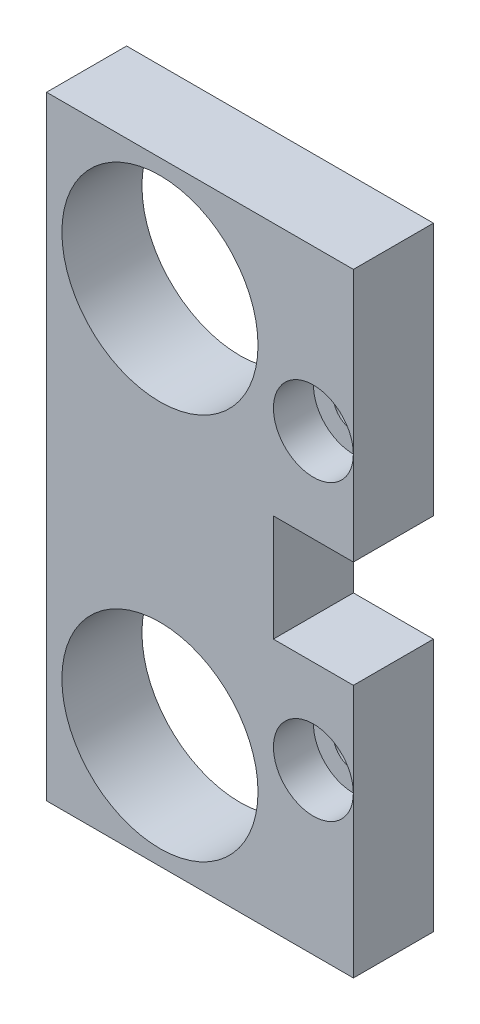
ISO-10303-21;
HEADER;
FILE_DESCRIPTION(('STEP AP214'),'2;1');
FILE_NAME('part.step','',(''),(''),'','','');
FILE_SCHEMA(('AUTOMOTIVE_DESIGN { 1 0 10303 214 1 1 1 1 }'));
ENDSEC;
DATA;
#1=APPLICATION_CONTEXT('core data for automotive mechanical design processes');
#2=APPLICATION_PROTOCOL_DEFINITION('international standard','automotive_design',2000,#1);
#3=PRODUCT_CONTEXT('',#1,'mechanical');
#4=PRODUCT('Part','Part','',(#3));
#5=PRODUCT_RELATED_PRODUCT_CATEGORY('part','',(#4));
#6=PRODUCT_DEFINITION_FORMATION('','',#4);
#7=PRODUCT_DEFINITION_CONTEXT('part definition',#1,'design');
#8=PRODUCT_DEFINITION('design','',#6,#7);
#9=PRODUCT_DEFINITION_SHAPE('','',#8);
#10=(LENGTH_UNIT() NAMED_UNIT(*) SI_UNIT(.MILLI.,.METRE.));
#11=(NAMED_UNIT(*) PLANE_ANGLE_UNIT() SI_UNIT($,.RADIAN.));
#12=(NAMED_UNIT(*) SI_UNIT($,.STERADIAN.) SOLID_ANGLE_UNIT());
#13=UNCERTAINTY_MEASURE_WITH_UNIT(LENGTH_MEASURE(1.E-05),#10,'distance_accuracy_value','');
#14=(GEOMETRIC_REPRESENTATION_CONTEXT(3) GLOBAL_UNCERTAINTY_ASSIGNED_CONTEXT((#13)) GLOBAL_UNIT_ASSIGNED_CONTEXT((#10,
#11,#12)) REPRESENTATION_CONTEXT('',''));
#15=CARTESIAN_POINT('',(0.,0.,0.));
#16=DIRECTION('',(0.,0.,1.));
#17=DIRECTION('',(1.,0.,0.));
#18=AXIS2_PLACEMENT_3D('',#15,#16,#17);
#19=CARTESIAN_POINT('',(50.,46.,6.));
#20=DIRECTION('',(1.,0.,0.));
#21=DIRECTION('',(0.,1.,0.));
#22=AXIS2_PLACEMENT_3D('',#19,#20,#21);
#23=PLANE('',#22);
#24=DIRECTION('',(0.,0.,1.));
#25=VECTOR('',#24,1.);
#26=CARTESIAN_POINT('',(50.,19.,0.));
#27=LINE('',#26,#25);
#28=CARTESIAN_POINT('',(50.,19.,0.));
#29=VERTEX_POINT('',#28);
#30=CARTESIAN_POINT('',(50.,19.,6.));
#31=VERTEX_POINT('',#30);
#32=EDGE_CURVE('E199',#29,#31,#27,.T.);
#33=ORIENTED_EDGE('',*,*,#32,.T.);
#34=DIRECTION('',(0.,-1.,0.));
#35=VECTOR('',#34,1.);
#36=CARTESIAN_POINT('',(50.,46.,6.));
#37=LINE('',#36,#35);
#38=CARTESIAN_POINT('',(50.,0.,6.));
#39=VERTEX_POINT('',#38);
#40=EDGE_CURVE('E180',#31,#39,#37,.T.);
#41=ORIENTED_EDGE('',*,*,#40,.T.);
#42=DIRECTION('',(0.,0.,-1.));
#43=VECTOR('',#42,1.);
#44=CARTESIAN_POINT('',(50.,0.,6.));
#45=LINE('',#44,#43);
#46=CARTESIAN_POINT('',(50.,0.,0.));
#47=VERTEX_POINT('',#46);
#48=EDGE_CURVE('E11',#39,#47,#45,.T.);
#49=ORIENTED_EDGE('',*,*,#48,.T.);
#50=DIRECTION('',(0.,-1.,0.));
#51=VECTOR('',#50,1.);
#52=CARTESIAN_POINT('',(50.,46.,0.));
#53=LINE('',#52,#51);
#54=EDGE_CURVE('E128',#29,#47,#53,.T.);
#55=ORIENTED_EDGE('',*,*,#54,.F.);
#56=EDGE_LOOP('',(#33,#41,#49,#55));
#57=FACE_BOUND('',#56,.T.);
#58=ADVANCED_FACE('F37',(#57),#23,.T.);
#59=CARTESIAN_POINT('',(47.,34.,0.));
#60=DIRECTION('',(0.,0.,1.));
#61=DIRECTION('',(1.,0.,0.));
#62=AXIS2_PLACEMENT_3D('',#59,#60,#61);
#63=CYLINDRICAL_SURFACE('',#62,1.5);
#64=CARTESIAN_POINT('',(47.,34.,0.));
#65=DIRECTION('',(0.,0.,1.));
#66=DIRECTION('',(1.,0.,0.));
#67=AXIS2_PLACEMENT_3D('',#64,#65,#66);
#68=CIRCLE('',#67,1.5);
#69=CARTESIAN_POINT('',(48.5,34.,0.));
#70=VERTEX_POINT('',#69);
#71=EDGE_CURVE('E144',#70,#70,#68,.T.);
#72=ORIENTED_EDGE('',*,*,#71,.F.);
#73=EDGE_LOOP('',(#72));
#74=FACE_BOUND('',#73,.T.);
#75=CARTESIAN_POINT('',(47.,34.,3.));
#76=DIRECTION('',(0.,0.,1.));
#77=DIRECTION('',(1.,0.,0.));
#78=AXIS2_PLACEMENT_3D('',#75,#76,#77);
#79=CIRCLE('',#78,1.5);
#80=CARTESIAN_POINT('',(48.5,34.,3.));
#81=VERTEX_POINT('',#80);
#82=EDGE_CURVE('E41',#81,#81,#79,.F.);
#83=ORIENTED_EDGE('',*,*,#82,.F.);
#84=EDGE_LOOP('',(#83));
#85=FACE_BOUND('',#84,.T.);
#86=ADVANCED_FACE('F238',(#74,#85),#63,.F.);
#87=CARTESIAN_POINT('',(47.,12.,0.));
#88=DIRECTION('',(0.,0.,1.));
#89=DIRECTION('',(1.,0.,0.));
#90=AXIS2_PLACEMENT_3D('',#87,#88,#89);
#91=CYLINDRICAL_SURFACE('',#90,1.5);
#92=CARTESIAN_POINT('',(47.,12.,0.));
#93=DIRECTION('',(0.,0.,1.));
#94=DIRECTION('',(1.,0.,0.));
#95=AXIS2_PLACEMENT_3D('',#92,#93,#94);
#96=CIRCLE('',#95,1.5);
#97=CARTESIAN_POINT('',(48.5,12.,0.));
#98=VERTEX_POINT('',#97);
#99=EDGE_CURVE('E139',#98,#98,#96,.T.);
#100=ORIENTED_EDGE('',*,*,#99,.F.);
#101=EDGE_LOOP('',(#100));
#102=FACE_BOUND('',#101,.T.);
#103=CARTESIAN_POINT('',(47.,12.,3.));
#104=DIRECTION('',(0.,0.,1.));
#105=DIRECTION('',(1.,0.,0.));
#106=AXIS2_PLACEMENT_3D('',#103,#104,#105);
#107=CIRCLE('',#106,1.5);
#108=CARTESIAN_POINT('',(48.5,12.,3.));
#109=VERTEX_POINT('',#108);
#110=EDGE_CURVE('E137',#109,#109,#107,.F.);
#111=ORIENTED_EDGE('',*,*,#110,.F.);
#112=EDGE_LOOP('',(#111));
#113=FACE_BOUND('',#112,.T.);
#114=ADVANCED_FACE('F243',(#102,#113),#91,.F.);
#115=CARTESIAN_POINT('',(0.,0.,6.));
#116=DIRECTION('',(0.,1.,0.));
#117=DIRECTION('',(0.,0.,1.));
#118=AXIS2_PLACEMENT_3D('',#115,#116,#117);
#119=PLANE('',#118);
#120=DIRECTION('',(1.,0.,0.));
#121=VECTOR('',#120,1.);
#122=CARTESIAN_POINT('',(0.,0.,6.));
#123=LINE('',#122,#121);
#124=CARTESIAN_POINT('',(27.,0.,6.));
#125=VERTEX_POINT('',#124);
#126=EDGE_CURVE('E130',#125,#39,#123,.T.);
#127=ORIENTED_EDGE('',*,*,#126,.F.);
#128=DIRECTION('',(0.,0.,1.));
#129=VECTOR('',#128,1.);
#130=CARTESIAN_POINT('',(27.,0.,0.));
#131=LINE('',#130,#129);
#132=CARTESIAN_POINT('',(27.,0.,0.));
#133=VERTEX_POINT('',#132);
#134=EDGE_CURVE('E175',#133,#125,#131,.T.);
#135=ORIENTED_EDGE('',*,*,#134,.F.);
#136=DIRECTION('',(1.,0.,0.));
#137=VECTOR('',#136,1.);
#138=CARTESIAN_POINT('',(0.,0.,0.));
#139=LINE('',#138,#137);
#140=EDGE_CURVE('E132',#133,#47,#139,.T.);
#141=ORIENTED_EDGE('',*,*,#140,.T.);
#142=ORIENTED_EDGE('',*,*,#48,.F.);
#143=EDGE_LOOP('',(#127,#135,#141,#142));
#144=FACE_BOUND('',#143,.T.);
#145=ADVANCED_FACE('F39',(#144),#119,.F.);
#146=DIRECTION('',(0.,0.,1.));
#147=VECTOR('',#146,1.);
#148=CARTESIAN_POINT('',(50.,27.,0.));
#149=LINE('',#148,#147);
#150=CARTESIAN_POINT('',(50.,27.,0.));
#151=VERTEX_POINT('',#150);
#152=CARTESIAN_POINT('',(50.,27.,6.));
#153=VERTEX_POINT('',#152);
#154=EDGE_CURVE('E107',#151,#153,#149,.T.);
#155=ORIENTED_EDGE('',*,*,#154,.F.);
#156=CARTESIAN_POINT('',(50.,46.,0.));
#157=VERTEX_POINT('',#156);
#158=EDGE_CURVE('E119',#157,#151,#53,.T.);
#159=ORIENTED_EDGE('',*,*,#158,.F.);
#160=DIRECTION('',(0.,0.,-1.));
#161=VECTOR('',#160,1.);
#162=CARTESIAN_POINT('',(50.,46.,6.));
#163=LINE('',#162,#161);
#164=CARTESIAN_POINT('',(50.,46.,6.));
#165=VERTEX_POINT('',#164);
#166=EDGE_CURVE('E46',#165,#157,#163,.T.);
#167=ORIENTED_EDGE('',*,*,#166,.F.);
#168=EDGE_CURVE('E121',#165,#153,#37,.T.);
#169=ORIENTED_EDGE('',*,*,#168,.T.);
#170=EDGE_LOOP('',(#155,#159,#167,#169));
#171=FACE_BOUND('',#170,.T.);
#172=ADVANCED_FACE('F117',(#171),#23,.T.);
#173=CARTESIAN_POINT('',(0.,46.,6.));
#174=DIRECTION('',(0.,1.,0.));
#175=DIRECTION('',(-1.,0.,0.));
#176=AXIS2_PLACEMENT_3D('',#173,#174,#175);
#177=PLANE('',#176);
#178=DIRECTION('',(0.,0.,1.));
#179=VECTOR('',#178,1.);
#180=CARTESIAN_POINT('',(27.,46.,0.));
#181=LINE('',#180,#179);
#182=CARTESIAN_POINT('',(27.,46.,0.));
#183=VERTEX_POINT('',#182);
#184=CARTESIAN_POINT('',(27.,46.,6.));
#185=VERTEX_POINT('',#184);
#186=EDGE_CURVE('E62',#183,#185,#181,.T.);
#187=ORIENTED_EDGE('',*,*,#186,.T.);
#188=DIRECTION('',(1.,0.,0.));
#189=VECTOR('',#188,1.);
#190=CARTESIAN_POINT('',(0.,46.,6.));
#191=LINE('',#190,#189);
#192=EDGE_CURVE('E136',#185,#165,#191,.T.);
#193=ORIENTED_EDGE('',*,*,#192,.T.);
#194=ORIENTED_EDGE('',*,*,#166,.T.);
#195=DIRECTION('',(1.,0.,0.));
#196=VECTOR('',#195,1.);
#197=CARTESIAN_POINT('',(0.,46.,0.));
#198=LINE('',#197,#196);
#199=EDGE_CURVE('E126',#183,#157,#198,.T.);
#200=ORIENTED_EDGE('',*,*,#199,.F.);
#201=EDGE_LOOP('',(#187,#193,#194,#200));
#202=FACE_BOUND('',#201,.T.);
#203=ADVANCED_FACE('F183',(#202),#177,.T.);
#204=CARTESIAN_POINT('',(0.,0.,6.));
#205=DIRECTION('',(0.,0.,1.));
#206=DIRECTION('',(1.,0.,0.));
#207=AXIS2_PLACEMENT_3D('',#204,#205,#206);
#208=PLANE('',#207);
#209=DIRECTION('',(1.,0.,0.));
#210=VECTOR('',#209,1.);
#211=CARTESIAN_POINT('',(50.,19.,6.));
#212=LINE('',#211,#210);
#213=CARTESIAN_POINT('',(44.,19.,6.));
#214=VERTEX_POINT('',#213);
#215=EDGE_CURVE('E112',#214,#31,#212,.T.);
#216=ORIENTED_EDGE('',*,*,#215,.F.);
#217=DIRECTION('',(0.,-1.,0.));
#218=VECTOR('',#217,1.);
#219=CARTESIAN_POINT('',(44.,27.,6.));
#220=LINE('',#219,#218);
#221=CARTESIAN_POINT('',(44.,27.,6.));
#222=VERTEX_POINT('',#221);
#223=EDGE_CURVE('E192',#222,#214,#220,.T.);
#224=ORIENTED_EDGE('',*,*,#223,.F.);
#225=DIRECTION('',(-1.,0.,0.));
#226=VECTOR('',#225,1.);
#227=CARTESIAN_POINT('',(50.,27.,6.));
#228=LINE('',#227,#226);
#229=EDGE_CURVE('E190',#153,#222,#228,.T.);
#230=ORIENTED_EDGE('',*,*,#229,.F.);
#231=ORIENTED_EDGE('',*,*,#168,.F.);
#232=ORIENTED_EDGE('',*,*,#192,.F.);
#233=DIRECTION('',(0.,1.,0.));
#234=VECTOR('',#233,1.);
#235=CARTESIAN_POINT('',(27.,46.,6.));
#236=LINE('',#235,#234);
#237=EDGE_CURVE('E169',#125,#185,#236,.T.);
#238=ORIENTED_EDGE('',*,*,#237,.F.);
#239=ORIENTED_EDGE('',*,*,#126,.T.);
#240=ORIENTED_EDGE('',*,*,#40,.F.);
#241=EDGE_LOOP('',(#216,#224,#230,#231,#232,#238,#239,#240));
#242=FACE_BOUND('',#241,.T.);
#243=CARTESIAN_POINT('',(47.,34.,6.));
#244=DIRECTION('',(0.,0.,1.));
#245=DIRECTION('',(1.,0.,0.));
#246=AXIS2_PLACEMENT_3D('',#243,#244,#245);
#247=CIRCLE('',#246,2.995);
#248=CARTESIAN_POINT('',(49.995,34.,6.));
#249=VERTEX_POINT('',#248);
#250=EDGE_CURVE('E154',#249,#249,#247,.T.);
#251=ORIENTED_EDGE('',*,*,#250,.F.);
#252=EDGE_LOOP('',(#251));
#253=FACE_BOUND('',#252,.T.);
#254=CARTESIAN_POINT('',(47.,12.,6.));
#255=DIRECTION('',(0.,0.,1.));
#256=DIRECTION('',(1.,0.,0.));
#257=AXIS2_PLACEMENT_3D('',#254,#255,#256);
#258=CIRCLE('',#257,2.995);
#259=CARTESIAN_POINT('',(49.995,12.,6.));
#260=VERTEX_POINT('',#259);
#261=EDGE_CURVE('E147',#260,#260,#258,.T.);
#262=ORIENTED_EDGE('',*,*,#261,.F.);
#263=EDGE_LOOP('',(#262));
#264=FACE_BOUND('',#263,.T.);
#265=CARTESIAN_POINT('',(35.5,8.5,6.));
#266=DIRECTION('',(0.,0.,1.));
#267=DIRECTION('',(1.,0.,0.));
#268=AXIS2_PLACEMENT_3D('',#265,#266,#267);
#269=CIRCLE('',#268,7.35);
#270=CARTESIAN_POINT('',(42.85,8.5,6.));
#271=VERTEX_POINT('',#270);
#272=EDGE_CURVE('E159',#271,#271,#269,.T.);
#273=ORIENTED_EDGE('',*,*,#272,.F.);
#274=EDGE_LOOP('',(#273));
#275=FACE_BOUND('',#274,.T.);
#276=CARTESIAN_POINT('',(35.5,37.5,6.));
#277=DIRECTION('',(0.,0.,1.));
#278=DIRECTION('',(1.,0.,0.));
#279=AXIS2_PLACEMENT_3D('',#276,#277,#278);
#280=CIRCLE('',#279,7.35);
#281=CARTESIAN_POINT('',(42.85,37.5,6.));
#282=VERTEX_POINT('',#281);
#283=EDGE_CURVE('E163',#282,#282,#280,.T.);
#284=ORIENTED_EDGE('',*,*,#283,.F.);
#285=EDGE_LOOP('',(#284));
#286=FACE_BOUND('',#285,.T.);
#287=ADVANCED_FACE('F187',(#242,#253,#264,#275,#286),#208,.T.);
#288=CARTESIAN_POINT('',(0.,0.,0.));
#289=DIRECTION('',(0.,0.,1.));
#290=DIRECTION('',(1.,0.,0.));
#291=AXIS2_PLACEMENT_3D('',#288,#289,#290);
#292=PLANE('',#291);
#293=ORIENTED_EDGE('',*,*,#99,.T.);
#294=EDGE_LOOP('',(#293));
#295=FACE_BOUND('',#294,.T.);
#296=ORIENTED_EDGE('',*,*,#71,.T.);
#297=EDGE_LOOP('',(#296));
#298=FACE_BOUND('',#297,.T.);
#299=CARTESIAN_POINT('',(35.5,8.5,0.));
#300=DIRECTION('',(0.,0.,1.));
#301=DIRECTION('',(1.,0.,0.));
#302=AXIS2_PLACEMENT_3D('',#299,#300,#301);
#303=CIRCLE('',#302,7.35);
#304=CARTESIAN_POINT('',(42.85,8.5,0.));
#305=VERTEX_POINT('',#304);
#306=EDGE_CURVE('E160',#305,#305,#303,.T.);
#307=ORIENTED_EDGE('',*,*,#306,.T.);
#308=EDGE_LOOP('',(#307));
#309=FACE_BOUND('',#308,.T.);
#310=CARTESIAN_POINT('',(35.5,37.5,0.));
#311=DIRECTION('',(0.,0.,1.));
#312=DIRECTION('',(1.,0.,0.));
#313=AXIS2_PLACEMENT_3D('',#310,#311,#312);
#314=CIRCLE('',#313,7.35);
#315=CARTESIAN_POINT('',(42.85,37.5,0.));
#316=VERTEX_POINT('',#315);
#317=EDGE_CURVE('E166',#316,#316,#314,.T.);
#318=ORIENTED_EDGE('',*,*,#317,.T.);
#319=EDGE_LOOP('',(#318));
#320=FACE_BOUND('',#319,.T.);
#321=DIRECTION('',(0.,-1.,0.));
#322=VECTOR('',#321,1.);
#323=CARTESIAN_POINT('',(44.,27.,0.));
#324=LINE('',#323,#322);
#325=CARTESIAN_POINT('',(44.,27.,0.));
#326=VERTEX_POINT('',#325);
#327=CARTESIAN_POINT('',(44.,19.,0.));
#328=VERTEX_POINT('',#327);
#329=EDGE_CURVE('E54',#326,#328,#324,.T.);
#330=ORIENTED_EDGE('',*,*,#329,.T.);
#331=DIRECTION('',(1.,0.,0.));
#332=VECTOR('',#331,1.);
#333=CARTESIAN_POINT('',(50.,19.,0.));
#334=LINE('',#333,#332);
#335=EDGE_CURVE('E122',#328,#29,#334,.T.);
#336=ORIENTED_EDGE('',*,*,#335,.T.);
#337=ORIENTED_EDGE('',*,*,#54,.T.);
#338=ORIENTED_EDGE('',*,*,#140,.F.);
#339=DIRECTION('',(0.,1.,0.));
#340=VECTOR('',#339,1.);
#341=CARTESIAN_POINT('',(27.,46.,0.));
#342=LINE('',#341,#340);
#343=EDGE_CURVE('E172',#133,#183,#342,.T.);
#344=ORIENTED_EDGE('',*,*,#343,.T.);
#345=ORIENTED_EDGE('',*,*,#199,.T.);
#346=ORIENTED_EDGE('',*,*,#158,.T.);
#347=DIRECTION('',(-1.,0.,0.));
#348=VECTOR('',#347,1.);
#349=CARTESIAN_POINT('',(50.,27.,0.));
#350=LINE('',#349,#348);
#351=EDGE_CURVE('E103',#151,#326,#350,.T.);
#352=ORIENTED_EDGE('',*,*,#351,.T.);
#353=EDGE_LOOP('',(#330,#336,#337,#338,#344,#345,#346,#352));
#354=FACE_BOUND('',#353,.T.);
#355=ADVANCED_FACE('F124',(#295,#298,#309,#320,#354),#292,.F.);
#356=CARTESIAN_POINT('',(27.,46.,0.));
#357=DIRECTION('',(1.,0.,0.));
#358=DIRECTION('',(0.,1.,0.));
#359=AXIS2_PLACEMENT_3D('',#356,#357,#358);
#360=PLANE('',#359);
#361=ORIENTED_EDGE('',*,*,#237,.T.);
#362=ORIENTED_EDGE('',*,*,#186,.F.);
#363=ORIENTED_EDGE('',*,*,#343,.F.);
#364=ORIENTED_EDGE('',*,*,#134,.T.);
#365=EDGE_LOOP('',(#361,#362,#363,#364));
#366=FACE_BOUND('',#365,.T.);
#367=ADVANCED_FACE('F225',(#366),#360,.F.);
#368=CARTESIAN_POINT('',(35.5,37.5,0.));
#369=DIRECTION('',(0.,0.,1.));
#370=DIRECTION('',(1.,0.,0.));
#371=AXIS2_PLACEMENT_3D('',#368,#369,#370);
#372=CYLINDRICAL_SURFACE('',#371,7.35);
#373=ORIENTED_EDGE('',*,*,#317,.F.);
#374=EDGE_LOOP('',(#373));
#375=FACE_BOUND('',#374,.T.);
#376=ORIENTED_EDGE('',*,*,#283,.T.);
#377=EDGE_LOOP('',(#376));
#378=FACE_BOUND('',#377,.T.);
#379=ADVANCED_FACE('F222',(#375,#378),#372,.F.);
#380=CARTESIAN_POINT('',(35.5,8.5,0.));
#381=DIRECTION('',(0.,0.,1.));
#382=DIRECTION('',(1.,0.,0.));
#383=AXIS2_PLACEMENT_3D('',#380,#381,#382);
#384=CYLINDRICAL_SURFACE('',#383,7.35);
#385=ORIENTED_EDGE('',*,*,#306,.F.);
#386=EDGE_LOOP('',(#385));
#387=FACE_BOUND('',#386,.T.);
#388=ORIENTED_EDGE('',*,*,#272,.T.);
#389=EDGE_LOOP('',(#388));
#390=FACE_BOUND('',#389,.T.);
#391=ADVANCED_FACE('F224',(#387,#390),#384,.F.);
#392=CARTESIAN_POINT('',(47.,12.,3.));
#393=DIRECTION('',(0.,0.,1.));
#394=DIRECTION('',(1.,0.,0.));
#395=AXIS2_PLACEMENT_3D('',#392,#393,#394);
#396=PLANE('',#395);
#397=CARTESIAN_POINT('',(47.,12.,3.));
#398=DIRECTION('',(0.,0.,1.));
#399=DIRECTION('',(1.,0.,0.));
#400=AXIS2_PLACEMENT_3D('',#397,#398,#399);
#401=CIRCLE('',#400,2.995);
#402=CARTESIAN_POINT('',(49.995,12.,3.));
#403=VERTEX_POINT('',#402);
#404=EDGE_CURVE('E140',#403,#403,#401,.T.);
#405=ORIENTED_EDGE('',*,*,#404,.T.);
#406=EDGE_LOOP('',(#405));
#407=FACE_BOUND('',#406,.T.);
#408=ORIENTED_EDGE('',*,*,#110,.T.);
#409=EDGE_LOOP('',(#408));
#410=FACE_BOUND('',#409,.T.);
#411=ADVANCED_FACE('F232',(#407,#410),#396,.T.);
#412=CARTESIAN_POINT('',(47.,12.,3.));
#413=DIRECTION('',(0.,0.,1.));
#414=DIRECTION('',(1.,0.,0.));
#415=AXIS2_PLACEMENT_3D('',#412,#413,#414);
#416=CYLINDRICAL_SURFACE('',#415,2.995);
#417=ORIENTED_EDGE('',*,*,#404,.F.);
#418=EDGE_LOOP('',(#417));
#419=FACE_BOUND('',#418,.T.);
#420=ORIENTED_EDGE('',*,*,#261,.T.);
#421=EDGE_LOOP('',(#420));
#422=FACE_BOUND('',#421,.T.);
#423=ADVANCED_FACE('F282',(#419,#422),#416,.F.);
#424=CARTESIAN_POINT('',(47.,34.,3.));
#425=DIRECTION('',(0.,0.,1.));
#426=DIRECTION('',(1.,0.,0.));
#427=AXIS2_PLACEMENT_3D('',#424,#425,#426);
#428=PLANE('',#427);
#429=CARTESIAN_POINT('',(47.,34.,3.));
#430=DIRECTION('',(0.,0.,1.));
#431=DIRECTION('',(1.,0.,0.));
#432=AXIS2_PLACEMENT_3D('',#429,#430,#431);
#433=CIRCLE('',#432,2.995);
#434=CARTESIAN_POINT('',(49.995,34.,3.));
#435=VERTEX_POINT('',#434);
#436=EDGE_CURVE('E204',#435,#435,#433,.T.);
#437=ORIENTED_EDGE('',*,*,#436,.T.);
#438=EDGE_LOOP('',(#437));
#439=FACE_BOUND('',#438,.T.);
#440=ORIENTED_EDGE('',*,*,#82,.T.);
#441=EDGE_LOOP('',(#440));
#442=FACE_BOUND('',#441,.T.);
#443=ADVANCED_FACE('F279',(#439,#442),#428,.T.);
#444=CARTESIAN_POINT('',(47.,34.,3.));
#445=DIRECTION('',(0.,0.,1.));
#446=DIRECTION('',(1.,0.,0.));
#447=AXIS2_PLACEMENT_3D('',#444,#445,#446);
#448=CYLINDRICAL_SURFACE('',#447,2.995);
#449=ORIENTED_EDGE('',*,*,#436,.F.);
#450=EDGE_LOOP('',(#449));
#451=FACE_BOUND('',#450,.T.);
#452=ORIENTED_EDGE('',*,*,#250,.T.);
#453=EDGE_LOOP('',(#452));
#454=FACE_BOUND('',#453,.T.);
#455=ADVANCED_FACE('F212',(#451,#454),#448,.F.);
#456=CARTESIAN_POINT('',(50.,19.,0.));
#457=DIRECTION('',(0.,-1.,0.));
#458=DIRECTION('',(0.,0.,-1.));
#459=AXIS2_PLACEMENT_3D('',#456,#457,#458);
#460=PLANE('',#459);
#461=ORIENTED_EDGE('',*,*,#215,.T.);
#462=ORIENTED_EDGE('',*,*,#32,.F.);
#463=ORIENTED_EDGE('',*,*,#335,.F.);
#464=DIRECTION('',(0.,0.,1.));
#465=VECTOR('',#464,1.);
#466=CARTESIAN_POINT('',(44.,19.,0.));
#467=LINE('',#466,#465);
#468=EDGE_CURVE('E202',#328,#214,#467,.T.);
#469=ORIENTED_EDGE('',*,*,#468,.T.);
#470=EDGE_LOOP('',(#461,#462,#463,#469));
#471=FACE_BOUND('',#470,.T.);
#472=ADVANCED_FACE('F268',(#471),#460,.F.);
#473=CARTESIAN_POINT('',(44.,27.,0.));
#474=DIRECTION('',(-1.,0.,0.));
#475=DIRECTION('',(0.,0.,1.));
#476=AXIS2_PLACEMENT_3D('',#473,#474,#475);
#477=PLANE('',#476);
#478=ORIENTED_EDGE('',*,*,#223,.T.);
#479=ORIENTED_EDGE('',*,*,#468,.F.);
#480=ORIENTED_EDGE('',*,*,#329,.F.);
#481=DIRECTION('',(0.,0.,1.));
#482=VECTOR('',#481,1.);
#483=CARTESIAN_POINT('',(44.,27.,0.));
#484=LINE('',#483,#482);
#485=EDGE_CURVE('E109',#326,#222,#484,.T.);
#486=ORIENTED_EDGE('',*,*,#485,.T.);
#487=EDGE_LOOP('',(#478,#479,#480,#486));
#488=FACE_BOUND('',#487,.T.);
#489=ADVANCED_FACE('F269',(#488),#477,.F.);
#490=CARTESIAN_POINT('',(50.,27.,0.));
#491=DIRECTION('',(0.,1.,0.));
#492=DIRECTION('',(0.,0.,1.));
#493=AXIS2_PLACEMENT_3D('',#490,#491,#492);
#494=PLANE('',#493);
#495=ORIENTED_EDGE('',*,*,#229,.T.);
#496=ORIENTED_EDGE('',*,*,#485,.F.);
#497=ORIENTED_EDGE('',*,*,#351,.F.);
#498=ORIENTED_EDGE('',*,*,#154,.T.);
#499=EDGE_LOOP('',(#495,#496,#497,#498));
#500=FACE_BOUND('',#499,.T.);
#501=ADVANCED_FACE('F106',(#500),#494,.F.);
#502=CLOSED_SHELL('',(#58,#86,#114,#145,#172,#203,#287,#355,#367,#379,#391,#411,#423,#443,#455,
#472,#489,#501));
#503=MANIFOLD_SOLID_BREP('B2',#502);
#504=ADVANCED_BREP_SHAPE_REPRESENTATION('',(#18,#503),#14);
#505=SHAPE_DEFINITION_REPRESENTATION(#9,#504);
ENDSEC;
END-ISO-10303-21;
